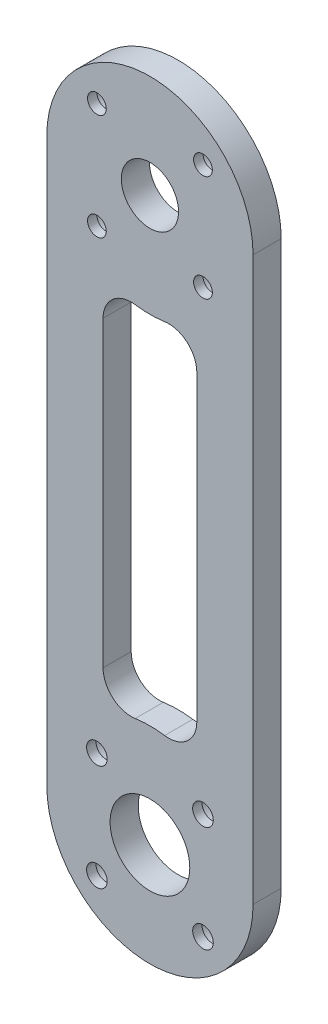
ISO-10303-21;
HEADER;
FILE_DESCRIPTION(('STEP AP214'),'2;1');
FILE_NAME('part.step','',(''),(''),'','','');
FILE_SCHEMA(('AUTOMOTIVE_DESIGN { 1 0 10303 214 1 1 1 1 }'));
ENDSEC;
DATA;
#1=APPLICATION_CONTEXT('core data for automotive mechanical design processes');
#2=APPLICATION_PROTOCOL_DEFINITION('international standard','automotive_design',2000,#1);
#3=PRODUCT_CONTEXT('',#1,'mechanical');
#4=PRODUCT('Part','Part','',(#3));
#5=PRODUCT_RELATED_PRODUCT_CATEGORY('part','',(#4));
#6=PRODUCT_DEFINITION_FORMATION('','',#4);
#7=PRODUCT_DEFINITION_CONTEXT('part definition',#1,'design');
#8=PRODUCT_DEFINITION('design','',#6,#7);
#9=PRODUCT_DEFINITION_SHAPE('','',#8);
#10=(LENGTH_UNIT() NAMED_UNIT(*) SI_UNIT(.MILLI.,.METRE.));
#11=(NAMED_UNIT(*) PLANE_ANGLE_UNIT() SI_UNIT($,.RADIAN.));
#12=(NAMED_UNIT(*) SI_UNIT($,.STERADIAN.) SOLID_ANGLE_UNIT());
#13=UNCERTAINTY_MEASURE_WITH_UNIT(LENGTH_MEASURE(1.E-05),#10,'distance_accuracy_value','');
#14=(GEOMETRIC_REPRESENTATION_CONTEXT(3) GLOBAL_UNCERTAINTY_ASSIGNED_CONTEXT((#13)) GLOBAL_UNIT_ASSIGNED_CONTEXT((#10,
#11,#12)) REPRESENTATION_CONTEXT('',''));
#15=CARTESIAN_POINT('',(0.,0.,0.));
#16=DIRECTION('',(0.,0.,1.));
#17=DIRECTION('',(1.,0.,0.));
#18=AXIS2_PLACEMENT_3D('',#15,#16,#17);
#19=CARTESIAN_POINT('',(5.65685424949247,24.3431457505077,8.62670273047588));
#20=DIRECTION('',(0.,0.,-1.));
#21=DIRECTION('',(1.,0.,0.));
#22=AXIS2_PLACEMENT_3D('',#19,#20,#21);
#23=CYLINDRICAL_SURFACE('',#22,1.);
#24=CARTESIAN_POINT('',(5.65685424949247,24.3431457505077,0.));
#25=DIRECTION('',(0.,0.,1.));
#26=DIRECTION('',(1.,0.,0.));
#27=AXIS2_PLACEMENT_3D('',#24,#25,#26);
#28=CIRCLE('',#27,1.);
#29=CARTESIAN_POINT('',(6.65685424949247,24.3431457505077,0.));
#30=VERTEX_POINT('',#29);
#31=EDGE_CURVE('E355',#30,#30,#28,.F.);
#32=ORIENTED_EDGE('',*,*,#31,.F.);
#33=EDGE_LOOP('',(#32));
#34=FACE_BOUND('',#33,.T.);
#35=CARTESIAN_POINT('',(5.65685424949247,24.3431457505077,-1.));
#36=DIRECTION('',(0.,0.,1.));
#37=DIRECTION('',(1.,0.,0.));
#38=AXIS2_PLACEMENT_3D('',#35,#36,#37);
#39=CIRCLE('',#38,1.);
#40=CARTESIAN_POINT('',(6.65685424949247,24.3431457505077,-1.));
#41=VERTEX_POINT('',#40);
#42=EDGE_CURVE('E450',#41,#41,#39,.F.);
#43=ORIENTED_EDGE('',*,*,#42,.T.);
#44=EDGE_LOOP('',(#43));
#45=FACE_BOUND('',#44,.T.);
#46=ADVANCED_FACE('F37',(#34,#45),#23,.F.);
#47=CARTESIAN_POINT('',(-5.65685424949235,24.3431457505076,8.62670273047588));
#48=DIRECTION('',(0.,0.,-1.));
#49=DIRECTION('',(1.,0.,0.));
#50=AXIS2_PLACEMENT_3D('',#47,#48,#49);
#51=CYLINDRICAL_SURFACE('',#50,1.);
#52=CARTESIAN_POINT('',(-5.65685424949235,24.3431457505076,0.));
#53=DIRECTION('',(0.,0.,1.));
#54=DIRECTION('',(1.,0.,0.));
#55=AXIS2_PLACEMENT_3D('',#52,#53,#54);
#56=CIRCLE('',#55,1.);
#57=CARTESIAN_POINT('',(-4.65685424949235,24.3431457505076,0.));
#58=VERTEX_POINT('',#57);
#59=EDGE_CURVE('E352',#58,#58,#56,.F.);
#60=ORIENTED_EDGE('',*,*,#59,.F.);
#61=EDGE_LOOP('',(#60));
#62=FACE_BOUND('',#61,.T.);
#63=CARTESIAN_POINT('',(-5.65685424949235,24.3431457505076,-1.));
#64=DIRECTION('',(0.,0.,1.));
#65=DIRECTION('',(1.,0.,0.));
#66=AXIS2_PLACEMENT_3D('',#63,#64,#65);
#67=CIRCLE('',#66,1.);
#68=CARTESIAN_POINT('',(-4.65685424949235,24.3431457505076,-1.));
#69=VERTEX_POINT('',#68);
#70=EDGE_CURVE('E448',#69,#69,#67,.F.);
#71=ORIENTED_EDGE('',*,*,#70,.T.);
#72=EDGE_LOOP('',(#71));
#73=FACE_BOUND('',#72,.T.);
#74=ADVANCED_FACE('F259',(#62,#73),#51,.F.);
#75=CARTESIAN_POINT('',(-5.65685424949243,35.6568542494923,8.62670273047588));
#76=DIRECTION('',(0.,0.,-1.));
#77=DIRECTION('',(1.,0.,0.));
#78=AXIS2_PLACEMENT_3D('',#75,#76,#77);
#79=CYLINDRICAL_SURFACE('',#78,1.);
#80=CARTESIAN_POINT('',(-5.65685424949243,35.6568542494923,0.));
#81=DIRECTION('',(0.,0.,1.));
#82=DIRECTION('',(1.,0.,0.));
#83=AXIS2_PLACEMENT_3D('',#80,#81,#82);
#84=CIRCLE('',#83,1.);
#85=CARTESIAN_POINT('',(-4.65685424949243,35.6568542494923,0.));
#86=VERTEX_POINT('',#85);
#87=EDGE_CURVE('E348',#86,#86,#84,.F.);
#88=ORIENTED_EDGE('',*,*,#87,.F.);
#89=EDGE_LOOP('',(#88));
#90=FACE_BOUND('',#89,.T.);
#91=CARTESIAN_POINT('',(-5.65685424949243,35.6568542494923,-1.));
#92=DIRECTION('',(0.,0.,1.));
#93=DIRECTION('',(1.,0.,0.));
#94=AXIS2_PLACEMENT_3D('',#91,#92,#93);
#95=CIRCLE('',#94,1.);
#96=CARTESIAN_POINT('',(-4.65685424949243,35.6568542494923,-1.));
#97=VERTEX_POINT('',#96);
#98=EDGE_CURVE('E458',#97,#97,#95,.F.);
#99=ORIENTED_EDGE('',*,*,#98,.T.);
#100=EDGE_LOOP('',(#99));
#101=FACE_BOUND('',#100,.T.);
#102=ADVANCED_FACE('F265',(#90,#101),#79,.F.);
#103=CARTESIAN_POINT('',(5.65685424949234,35.6568542494924,8.62670273047588));
#104=DIRECTION('',(0.,0.,-1.));
#105=DIRECTION('',(1.,0.,0.));
#106=AXIS2_PLACEMENT_3D('',#103,#104,#105);
#107=CYLINDRICAL_SURFACE('',#106,1.);
#108=CARTESIAN_POINT('',(5.65685424949234,35.6568542494924,0.));
#109=DIRECTION('',(0.,0.,1.));
#110=DIRECTION('',(1.,0.,0.));
#111=AXIS2_PLACEMENT_3D('',#108,#109,#110);
#112=CIRCLE('',#111,1.);
#113=CARTESIAN_POINT('',(6.65685424949234,35.6568542494924,0.));
#114=VERTEX_POINT('',#113);
#115=EDGE_CURVE('E359',#114,#114,#112,.F.);
#116=ORIENTED_EDGE('',*,*,#115,.F.);
#117=EDGE_LOOP('',(#116));
#118=FACE_BOUND('',#117,.T.);
#119=CARTESIAN_POINT('',(5.65685424949234,35.6568542494924,-1.));
#120=DIRECTION('',(0.,0.,1.));
#121=DIRECTION('',(1.,0.,0.));
#122=AXIS2_PLACEMENT_3D('',#119,#120,#121);
#123=CIRCLE('',#122,1.);
#124=CARTESIAN_POINT('',(6.65685424949234,35.6568542494924,-1.));
#125=VERTEX_POINT('',#124);
#126=EDGE_CURVE('E436',#125,#125,#123,.F.);
#127=ORIENTED_EDGE('',*,*,#126,.T.);
#128=EDGE_LOOP('',(#127));
#129=FACE_BOUND('',#128,.T.);
#130=ADVANCED_FACE('F283',(#118,#129),#107,.F.);
#131=CARTESIAN_POINT('',(-5.65685424949239,-35.6568542494924,12.0208152801713));
#132=DIRECTION('',(0.,0.,-1.));
#133=DIRECTION('',(1.,0.,0.));
#134=AXIS2_PLACEMENT_3D('',#131,#132,#133);
#135=CYLINDRICAL_SURFACE('',#134,1.1);
#136=CARTESIAN_POINT('',(-5.65685424949239,-35.6568542494924,0.));
#137=DIRECTION('',(0.,0.,1.));
#138=DIRECTION('',(1.,0.,0.));
#139=AXIS2_PLACEMENT_3D('',#136,#137,#138);
#140=CIRCLE('',#139,1.1);
#141=CARTESIAN_POINT('',(-4.55685424949239,-35.6568542494924,0.));
#142=VERTEX_POINT('',#141);
#143=EDGE_CURVE('E375',#142,#142,#140,.F.);
#144=ORIENTED_EDGE('',*,*,#143,.F.);
#145=EDGE_LOOP('',(#144));
#146=FACE_BOUND('',#145,.T.);
#147=CARTESIAN_POINT('',(-5.65685424949239,-35.6568542494924,-1.));
#148=DIRECTION('',(0.,0.,1.));
#149=DIRECTION('',(1.,0.,0.));
#150=AXIS2_PLACEMENT_3D('',#147,#148,#149);
#151=CIRCLE('',#150,1.1);
#152=CARTESIAN_POINT('',(-4.55685424949239,-35.6568542494924,-1.));
#153=VERTEX_POINT('',#152);
#154=EDGE_CURVE('E411',#153,#153,#151,.F.);
#155=ORIENTED_EDGE('',*,*,#154,.T.);
#156=EDGE_LOOP('',(#155));
#157=FACE_BOUND('',#156,.T.);
#158=ADVANCED_FACE('F286',(#146,#157),#135,.F.);
#159=CARTESIAN_POINT('',(5.65685424949235,-35.6568542494924,12.0208152801713));
#160=DIRECTION('',(0.,0.,-1.));
#161=DIRECTION('',(1.,0.,0.));
#162=AXIS2_PLACEMENT_3D('',#159,#160,#161);
#163=CYLINDRICAL_SURFACE('',#162,1.1);
#164=CARTESIAN_POINT('',(5.65685424949235,-35.6568542494924,0.));
#165=DIRECTION('',(0.,0.,1.));
#166=DIRECTION('',(1.,0.,0.));
#167=AXIS2_PLACEMENT_3D('',#164,#165,#166);
#168=CIRCLE('',#167,1.1);
#169=CARTESIAN_POINT('',(6.75685424949235,-35.6568542494924,0.));
#170=VERTEX_POINT('',#169);
#171=EDGE_CURVE('E371',#170,#170,#168,.F.);
#172=ORIENTED_EDGE('',*,*,#171,.F.);
#173=EDGE_LOOP('',(#172));
#174=FACE_BOUND('',#173,.T.);
#175=CARTESIAN_POINT('',(5.65685424949235,-35.6568542494924,-1.));
#176=DIRECTION('',(0.,0.,1.));
#177=DIRECTION('',(1.,0.,0.));
#178=AXIS2_PLACEMENT_3D('',#175,#176,#177);
#179=CIRCLE('',#178,1.1);
#180=CARTESIAN_POINT('',(6.75685424949235,-35.6568542494924,-1.));
#181=VERTEX_POINT('',#180);
#182=EDGE_CURVE('E398',#181,#181,#179,.F.);
#183=ORIENTED_EDGE('',*,*,#182,.T.);
#184=EDGE_LOOP('',(#183));
#185=FACE_BOUND('',#184,.T.);
#186=ADVANCED_FACE('F318',(#174,#185),#163,.F.);
#187=CARTESIAN_POINT('',(-5.65685424949231,-24.3431457505075,12.0208152801713));
#188=DIRECTION('',(0.,0.,-1.));
#189=DIRECTION('',(1.,0.,0.));
#190=AXIS2_PLACEMENT_3D('',#187,#188,#189);
#191=CYLINDRICAL_SURFACE('',#190,1.1);
#192=CARTESIAN_POINT('',(-5.65685424949231,-24.3431457505075,0.));
#193=DIRECTION('',(0.,0.,1.));
#194=DIRECTION('',(1.,0.,0.));
#195=AXIS2_PLACEMENT_3D('',#192,#193,#194);
#196=CIRCLE('',#195,1.1);
#197=CARTESIAN_POINT('',(-4.55685424949231,-24.3431457505075,0.));
#198=VERTEX_POINT('',#197);
#199=EDGE_CURVE('E367',#198,#198,#196,.F.);
#200=ORIENTED_EDGE('',*,*,#199,.F.);
#201=EDGE_LOOP('',(#200));
#202=FACE_BOUND('',#201,.T.);
#203=CARTESIAN_POINT('',(-5.65685424949231,-24.3431457505075,-1.));
#204=DIRECTION('',(0.,0.,1.));
#205=DIRECTION('',(1.,0.,0.));
#206=AXIS2_PLACEMENT_3D('',#203,#204,#205);
#207=CIRCLE('',#206,1.1);
#208=CARTESIAN_POINT('',(-4.55685424949231,-24.3431457505075,-1.));
#209=VERTEX_POINT('',#208);
#210=EDGE_CURVE('E401',#209,#209,#207,.F.);
#211=ORIENTED_EDGE('',*,*,#210,.T.);
#212=EDGE_LOOP('',(#211));
#213=FACE_BOUND('',#212,.T.);
#214=ADVANCED_FACE('F322',(#202,#213),#191,.F.);
#215=CARTESIAN_POINT('',(5.65685424949239,-24.3431457505076,12.0208152801713));
#216=DIRECTION('',(0.,0.,-1.));
#217=DIRECTION('',(1.,0.,0.));
#218=AXIS2_PLACEMENT_3D('',#215,#216,#217);
#219=CYLINDRICAL_SURFACE('',#218,1.1);
#220=CARTESIAN_POINT('',(5.65685424949239,-24.3431457505076,0.));
#221=DIRECTION('',(0.,0.,1.));
#222=DIRECTION('',(1.,0.,0.));
#223=AXIS2_PLACEMENT_3D('',#220,#221,#222);
#224=CIRCLE('',#223,1.1);
#225=CARTESIAN_POINT('',(6.75685424949239,-24.3431457505076,0.));
#226=VERTEX_POINT('',#225);
#227=EDGE_CURVE('E381',#226,#226,#224,.F.);
#228=ORIENTED_EDGE('',*,*,#227,.F.);
#229=EDGE_LOOP('',(#228));
#230=FACE_BOUND('',#229,.T.);
#231=CARTESIAN_POINT('',(5.65685424949239,-24.3431457505076,-1.));
#232=DIRECTION('',(0.,0.,1.));
#233=DIRECTION('',(1.,0.,0.));
#234=AXIS2_PLACEMENT_3D('',#231,#232,#233);
#235=CIRCLE('',#234,1.1);
#236=CARTESIAN_POINT('',(6.75685424949239,-24.3431457505076,-1.));
#237=VERTEX_POINT('',#236);
#238=EDGE_CURVE('E383',#237,#237,#235,.F.);
#239=ORIENTED_EDGE('',*,*,#238,.T.);
#240=EDGE_LOOP('',(#239));
#241=FACE_BOUND('',#240,.T.);
#242=ADVANCED_FACE('F326',(#230,#241),#219,.F.);
#243=CARTESIAN_POINT('',(0.,30.,-3.));
#244=DIRECTION('',(0.,0.,1.));
#245=DIRECTION('',(-1.,0.,0.));
#246=AXIS2_PLACEMENT_3D('',#243,#244,#245);
#247=CYLINDRICAL_SURFACE('',#246,11.);
#248=CARTESIAN_POINT('',(0.,30.,0.));
#249=DIRECTION('',(0.,0.,1.));
#250=DIRECTION('',(1.,0.,0.));
#251=AXIS2_PLACEMENT_3D('',#248,#249,#250);
#252=CIRCLE('',#251,11.);
#253=CARTESIAN_POINT('',(11.,30.,0.));
#254=VERTEX_POINT('',#253);
#255=CARTESIAN_POINT('',(-11.,30.,0.));
#256=VERTEX_POINT('',#255);
#257=EDGE_CURVE('E175',#254,#256,#252,.T.);
#258=ORIENTED_EDGE('',*,*,#257,.F.);
#259=DIRECTION('',(0.,0.,1.));
#260=VECTOR('',#259,1.);
#261=CARTESIAN_POINT('',(11.,30.,-3.));
#262=LINE('',#261,#260);
#263=CARTESIAN_POINT('',(11.,30.,-3.));
#264=VERTEX_POINT('',#263);
#265=EDGE_CURVE('E151',#264,#254,#262,.T.);
#266=ORIENTED_EDGE('',*,*,#265,.F.);
#267=CARTESIAN_POINT('',(0.,30.,-3.));
#268=DIRECTION('',(0.,0.,1.));
#269=DIRECTION('',(1.,0.,0.));
#270=AXIS2_PLACEMENT_3D('',#267,#268,#269);
#271=CIRCLE('',#270,11.);
#272=CARTESIAN_POINT('',(-11.,30.,-3.));
#273=VERTEX_POINT('',#272);
#274=EDGE_CURVE('E130',#264,#273,#271,.T.);
#275=ORIENTED_EDGE('',*,*,#274,.T.);
#276=DIRECTION('',(0.,0.,1.));
#277=VECTOR('',#276,1.);
#278=CARTESIAN_POINT('',(-11.,30.,-3.));
#279=LINE('',#278,#277);
#280=EDGE_CURVE('E139',#273,#256,#279,.T.);
#281=ORIENTED_EDGE('',*,*,#280,.T.);
#282=EDGE_LOOP('',(#258,#266,#275,#281));
#283=FACE_BOUND('',#282,.T.);
#284=ADVANCED_FACE('F149',(#283),#247,.T.);
#285=CARTESIAN_POINT('',(-11.,0.,-3.));
#286=DIRECTION('',(1.,0.,0.));
#287=DIRECTION('',(0.,1.,0.));
#288=AXIS2_PLACEMENT_3D('',#285,#286,#287);
#289=PLANE('',#288);
#290=DIRECTION('',(0.,-1.,0.));
#291=VECTOR('',#290,1.);
#292=CARTESIAN_POINT('',(-11.,0.,0.));
#293=LINE('',#292,#291);
#294=CARTESIAN_POINT('',(-11.,-30.,0.));
#295=VERTEX_POINT('',#294);
#296=EDGE_CURVE('E142',#256,#295,#293,.T.);
#297=ORIENTED_EDGE('',*,*,#296,.F.);
#298=ORIENTED_EDGE('',*,*,#280,.F.);
#299=DIRECTION('',(0.,-1.,0.));
#300=VECTOR('',#299,1.);
#301=CARTESIAN_POINT('',(-11.,0.,-3.));
#302=LINE('',#301,#300);
#303=CARTESIAN_POINT('',(-11.,-30.,-3.));
#304=VERTEX_POINT('',#303);
#305=EDGE_CURVE('E126',#273,#304,#302,.T.);
#306=ORIENTED_EDGE('',*,*,#305,.T.);
#307=DIRECTION('',(0.,0.,1.));
#308=VECTOR('',#307,1.);
#309=CARTESIAN_POINT('',(-11.,-30.,-3.));
#310=LINE('',#309,#308);
#311=EDGE_CURVE('E147',#304,#295,#310,.T.);
#312=ORIENTED_EDGE('',*,*,#311,.T.);
#313=EDGE_LOOP('',(#297,#298,#306,#312));
#314=FACE_BOUND('',#313,.T.);
#315=ADVANCED_FACE('F140',(#314),#289,.F.);
#316=CARTESIAN_POINT('',(0.,-30.,-3.));
#317=DIRECTION('',(0.,0.,1.));
#318=DIRECTION('',(-1.,0.,0.));
#319=AXIS2_PLACEMENT_3D('',#316,#317,#318);
#320=CYLINDRICAL_SURFACE('',#319,11.);
#321=CARTESIAN_POINT('',(0.,-30.,0.));
#322=DIRECTION('',(0.,0.,1.));
#323=DIRECTION('',(1.,0.,0.));
#324=AXIS2_PLACEMENT_3D('',#321,#322,#323);
#325=CIRCLE('',#324,11.);
#326=CARTESIAN_POINT('',(11.,-30.,0.));
#327=VERTEX_POINT('',#326);
#328=EDGE_CURVE('E169',#295,#327,#325,.T.);
#329=ORIENTED_EDGE('',*,*,#328,.F.);
#330=ORIENTED_EDGE('',*,*,#311,.F.);
#331=CARTESIAN_POINT('',(0.,-30.,-3.));
#332=DIRECTION('',(0.,0.,1.));
#333=DIRECTION('',(1.,0.,0.));
#334=AXIS2_PLACEMENT_3D('',#331,#332,#333);
#335=CIRCLE('',#334,11.);
#336=CARTESIAN_POINT('',(11.,-30.,-3.));
#337=VERTEX_POINT('',#336);
#338=EDGE_CURVE('E133',#304,#337,#335,.T.);
#339=ORIENTED_EDGE('',*,*,#338,.T.);
#340=DIRECTION('',(0.,0.,1.));
#341=VECTOR('',#340,1.);
#342=CARTESIAN_POINT('',(11.,-30.,-3.));
#343=LINE('',#342,#341);
#344=EDGE_CURVE('E181',#337,#327,#343,.T.);
#345=ORIENTED_EDGE('',*,*,#344,.T.);
#346=EDGE_LOOP('',(#329,#330,#339,#345));
#347=FACE_BOUND('',#346,.T.);
#348=ADVANCED_FACE('F242',(#347),#320,.T.);
#349=CARTESIAN_POINT('',(5.,0.,-3.));
#350=DIRECTION('',(1.,0.,0.));
#351=DIRECTION('',(0.,0.,1.));
#352=AXIS2_PLACEMENT_3D('',#349,#350,#351);
#353=PLANE('',#352);
#354=DIRECTION('',(0.,-1.,0.));
#355=VECTOR('',#354,1.);
#356=CARTESIAN_POINT('',(5.,0.,0.));
#357=LINE('',#356,#355);
#358=CARTESIAN_POINT('',(5.,16.143593539449,0.));
#359=VERTEX_POINT('',#358);
#360=CARTESIAN_POINT('',(5.,-16.143593539449,0.));
#361=VERTEX_POINT('',#360);
#362=EDGE_CURVE('E161',#359,#361,#357,.T.);
#363=ORIENTED_EDGE('',*,*,#362,.F.);
#364=DIRECTION('',(0.,0.,-1.));
#365=VECTOR('',#364,1.);
#366=CARTESIAN_POINT('',(5.,16.143593539449,0.));
#367=LINE('',#366,#365);
#368=CARTESIAN_POINT('',(5.,16.143593539449,-3.));
#369=VERTEX_POINT('',#368);
#370=EDGE_CURVE('E195',#369,#359,#367,.F.);
#371=ORIENTED_EDGE('',*,*,#370,.F.);
#372=DIRECTION('',(0.,-1.,0.));
#373=VECTOR('',#372,1.);
#374=CARTESIAN_POINT('',(5.,0.,-3.));
#375=LINE('',#374,#373);
#376=CARTESIAN_POINT('',(5.,-16.143593539449,-3.));
#377=VERTEX_POINT('',#376);
#378=EDGE_CURVE('E179',#369,#377,#375,.T.);
#379=ORIENTED_EDGE('',*,*,#378,.T.);
#380=DIRECTION('',(0.,0.,-1.));
#381=VECTOR('',#380,1.);
#382=CARTESIAN_POINT('',(5.,-16.143593539449,-3.));
#383=LINE('',#382,#381);
#384=EDGE_CURVE('E198',#361,#377,#383,.T.);
#385=ORIENTED_EDGE('',*,*,#384,.F.);
#386=EDGE_LOOP('',(#363,#371,#379,#385));
#387=FACE_BOUND('',#386,.T.);
#388=ADVANCED_FACE('F538',(#387),#353,.F.);
#389=CARTESIAN_POINT('',(1.57142857142857,-19.1128234952813,0.));
#390=VERTEX_POINT('',#389);
#391=CARTESIAN_POINT('',(-1.57142857142857,-19.1128234952813,0.));
#392=VERTEX_POINT('',#391);
#393=EDGE_CURVE('E164',#390,#392,#325,.T.);
#394=ORIENTED_EDGE('',*,*,#393,.F.);
#395=DIRECTION('',(0.,0.,1.));
#396=VECTOR('',#395,1.);
#397=CARTESIAN_POINT('',(1.57142857142857,-19.1128234952813,-3.));
#398=LINE('',#397,#396);
#399=CARTESIAN_POINT('',(1.57142857142857,-19.1128234952813,-3.));
#400=VERTEX_POINT('',#399);
#401=EDGE_CURVE('E189',#400,#390,#398,.T.);
#402=ORIENTED_EDGE('',*,*,#401,.F.);
#403=CARTESIAN_POINT('',(-1.57142857142857,-19.1128234952813,-3.));
#404=VERTEX_POINT('',#403);
#405=EDGE_CURVE('E233',#400,#404,#335,.T.);
#406=ORIENTED_EDGE('',*,*,#405,.T.);
#407=DIRECTION('',(0.,0.,1.));
#408=VECTOR('',#407,1.);
#409=CARTESIAN_POINT('',(-1.57142857142857,-19.1128234952813,-3.));
#410=LINE('',#409,#408);
#411=EDGE_CURVE('E192',#392,#404,#410,.F.);
#412=ORIENTED_EDGE('',*,*,#411,.F.);
#413=EDGE_LOOP('',(#394,#402,#406,#412));
#414=FACE_BOUND('',#413,.T.);
#415=ADVANCED_FACE('F707',(#414),#320,.T.);
#416=CARTESIAN_POINT('',(-5.,0.,-3.));
#417=DIRECTION('',(1.,0.,0.));
#418=DIRECTION('',(0.,0.,1.));
#419=AXIS2_PLACEMENT_3D('',#416,#417,#418);
#420=PLANE('',#419);
#421=DIRECTION('',(0.,-1.,0.));
#422=VECTOR('',#421,1.);
#423=CARTESIAN_POINT('',(-5.,0.,-3.));
#424=LINE('',#423,#422);
#425=CARTESIAN_POINT('',(-5.,16.143593539449,-3.));
#426=VERTEX_POINT('',#425);
#427=CARTESIAN_POINT('',(-5.,-16.143593539449,-3.));
#428=VERTEX_POINT('',#427);
#429=EDGE_CURVE('E155',#426,#428,#424,.T.);
#430=ORIENTED_EDGE('',*,*,#429,.F.);
#431=DIRECTION('',(0.,0.,1.));
#432=VECTOR('',#431,1.);
#433=CARTESIAN_POINT('',(-5.,16.143593539449,-3.));
#434=LINE('',#433,#432);
#435=CARTESIAN_POINT('',(-5.,16.143593539449,0.));
#436=VERTEX_POINT('',#435);
#437=EDGE_CURVE('E146',#436,#426,#434,.F.);
#438=ORIENTED_EDGE('',*,*,#437,.F.);
#439=DIRECTION('',(0.,-1.,0.));
#440=VECTOR('',#439,1.);
#441=CARTESIAN_POINT('',(-5.,0.,0.));
#442=LINE('',#441,#440);
#443=CARTESIAN_POINT('',(-5.,-16.143593539449,0.));
#444=VERTEX_POINT('',#443);
#445=EDGE_CURVE('E168',#436,#444,#442,.T.);
#446=ORIENTED_EDGE('',*,*,#445,.T.);
#447=DIRECTION('',(0.,0.,1.));
#448=VECTOR('',#447,1.);
#449=CARTESIAN_POINT('',(-5.,-16.143593539449,-3.));
#450=LINE('',#449,#448);
#451=EDGE_CURVE('E186',#428,#444,#450,.T.);
#452=ORIENTED_EDGE('',*,*,#451,.F.);
#453=EDGE_LOOP('',(#430,#438,#446,#452));
#454=FACE_BOUND('',#453,.T.);
#455=ADVANCED_FACE('F232',(#454),#420,.T.);
#456=CARTESIAN_POINT('',(-1.57142857142858,19.1128234952813,-3.));
#457=VERTEX_POINT('',#456);
#458=CARTESIAN_POINT('',(1.57142857142857,19.1128234952813,-3.));
#459=VERTEX_POINT('',#458);
#460=EDGE_CURVE('E152',#457,#459,#271,.T.);
#461=ORIENTED_EDGE('',*,*,#460,.T.);
#462=DIRECTION('',(0.,0.,1.));
#463=VECTOR('',#462,1.);
#464=CARTESIAN_POINT('',(1.57142857142857,19.1128234952813,-3.));
#465=LINE('',#464,#463);
#466=CARTESIAN_POINT('',(1.57142857142857,19.1128234952813,0.));
#467=VERTEX_POINT('',#466);
#468=EDGE_CURVE('E201',#467,#459,#465,.F.);
#469=ORIENTED_EDGE('',*,*,#468,.F.);
#470=CARTESIAN_POINT('',(-1.57142857142858,19.1128234952813,0.));
#471=VERTEX_POINT('',#470);
#472=EDGE_CURVE('E172',#471,#467,#252,.T.);
#473=ORIENTED_EDGE('',*,*,#472,.F.);
#474=DIRECTION('',(0.,0.,1.));
#475=VECTOR('',#474,1.);
#476=CARTESIAN_POINT('',(-1.57142857142858,19.1128234952813,-3.));
#477=LINE('',#476,#475);
#478=EDGE_CURVE('E203',#457,#471,#477,.T.);
#479=ORIENTED_EDGE('',*,*,#478,.F.);
#480=EDGE_LOOP('',(#461,#469,#473,#479));
#481=FACE_BOUND('',#480,.T.);
#482=ADVANCED_FACE('F225',(#481),#247,.T.);
#483=CARTESIAN_POINT('',(11.,0.,-3.));
#484=DIRECTION('',(1.,0.,0.));
#485=DIRECTION('',(0.,1.,0.));
#486=AXIS2_PLACEMENT_3D('',#483,#484,#485);
#487=PLANE('',#486);
#488=DIRECTION('',(0.,-1.,0.));
#489=VECTOR('',#488,1.);
#490=CARTESIAN_POINT('',(11.,0.,0.));
#491=LINE('',#490,#489);
#492=EDGE_CURVE('E177',#254,#327,#491,.T.);
#493=ORIENTED_EDGE('',*,*,#492,.T.);
#494=ORIENTED_EDGE('',*,*,#344,.F.);
#495=DIRECTION('',(0.,-1.,0.));
#496=VECTOR('',#495,1.);
#497=CARTESIAN_POINT('',(11.,0.,-3.));
#498=LINE('',#497,#496);
#499=EDGE_CURVE('E159',#264,#337,#498,.T.);
#500=ORIENTED_EDGE('',*,*,#499,.F.);
#501=ORIENTED_EDGE('',*,*,#265,.T.);
#502=EDGE_LOOP('',(#493,#494,#500,#501));
#503=FACE_BOUND('',#502,.T.);
#504=ADVANCED_FACE('F246',(#503),#487,.T.);
#505=CARTESIAN_POINT('',(0.,0.,-3.));
#506=DIRECTION('',(0.,0.,-1.));
#507=DIRECTION('',(1.,0.,0.));
#508=AXIS2_PLACEMENT_3D('',#505,#506,#507);
#509=PLANE('',#508);
#510=CARTESIAN_POINT('',(-5.65685424949243,35.6568542494923,-3.));
#511=DIRECTION('',(0.,0.,1.));
#512=DIRECTION('',(0.,1.,0.));
#513=AXIS2_PLACEMENT_3D('',#510,#511,#512);
#514=CIRCLE('',#513,2.00000000000001);
#515=CARTESIAN_POINT('',(-5.65685424949244,37.6568542494923,-3.));
#516=VERTEX_POINT('',#515);
#517=EDGE_CURVE('E466',#516,#516,#514,.T.);
#518=ORIENTED_EDGE('',*,*,#517,.T.);
#519=EDGE_LOOP('',(#518));
#520=FACE_BOUND('',#519,.T.);
#521=CARTESIAN_POINT('',(-5.65685424949235,24.3431457505076,-3.));
#522=DIRECTION('',(0.,0.,1.));
#523=DIRECTION('',(-1.,0.,0.));
#524=AXIS2_PLACEMENT_3D('',#521,#522,#523);
#525=CIRCLE('',#524,2.00000000000001);
#526=CARTESIAN_POINT('',(-7.65685424949236,24.3431457505076,-3.));
#527=VERTEX_POINT('',#526);
#528=EDGE_CURVE('E459',#527,#527,#525,.T.);
#529=ORIENTED_EDGE('',*,*,#528,.T.);
#530=EDGE_LOOP('',(#529));
#531=FACE_BOUND('',#530,.T.);
#532=CARTESIAN_POINT('',(5.65685424949247,24.3431457505077,-3.));
#533=DIRECTION('',(0.,0.,1.));
#534=DIRECTION('',(0.,-1.,0.));
#535=AXIS2_PLACEMENT_3D('',#532,#533,#534);
#536=CIRCLE('',#535,2.00000000000001);
#537=CARTESIAN_POINT('',(5.65685424949249,22.3431457505077,-3.));
#538=VERTEX_POINT('',#537);
#539=EDGE_CURVE('E449',#538,#538,#536,.T.);
#540=ORIENTED_EDGE('',*,*,#539,.T.);
#541=EDGE_LOOP('',(#540));
#542=FACE_BOUND('',#541,.T.);
#543=CARTESIAN_POINT('',(5.65685424949234,35.6568542494924,-3.));
#544=DIRECTION('',(0.,0.,1.));
#545=DIRECTION('',(1.,0.,0.));
#546=AXIS2_PLACEMENT_3D('',#543,#544,#545);
#547=CIRCLE('',#546,2.00000000000001);
#548=CARTESIAN_POINT('',(7.65685424949235,35.6568542494924,-3.));
#549=VERTEX_POINT('',#548);
#550=EDGE_CURVE('E435',#549,#549,#547,.T.);
#551=ORIENTED_EDGE('',*,*,#550,.T.);
#552=EDGE_LOOP('',(#551));
#553=FACE_BOUND('',#552,.T.);
#554=CARTESIAN_POINT('',(0.,30.,-3.));
#555=DIRECTION('',(0.,0.,1.));
#556=DIRECTION('',(1.,0.,0.));
#557=AXIS2_PLACEMENT_3D('',#554,#555,#556);
#558=CIRCLE('',#557,3.05);
#559=CARTESIAN_POINT('',(3.05,30.,-3.));
#560=VERTEX_POINT('',#559);
#561=EDGE_CURVE('E428',#560,#560,#558,.T.);
#562=ORIENTED_EDGE('',*,*,#561,.T.);
#563=EDGE_LOOP('',(#562));
#564=FACE_BOUND('',#563,.T.);
#565=CARTESIAN_POINT('',(5.65685424949235,-35.6568542494924,-3.));
#566=DIRECTION('',(0.,0.,1.));
#567=DIRECTION('',(0.,-1.,0.));
#568=AXIS2_PLACEMENT_3D('',#565,#566,#567);
#569=CIRCLE('',#568,2.);
#570=CARTESIAN_POINT('',(5.65685424949234,-37.6568542494924,-3.));
#571=VERTEX_POINT('',#570);
#572=EDGE_CURVE('E414',#571,#571,#569,.T.);
#573=ORIENTED_EDGE('',*,*,#572,.T.);
#574=EDGE_LOOP('',(#573));
#575=FACE_BOUND('',#574,.T.);
#576=CARTESIAN_POINT('',(-5.65685424949239,-35.6568542494924,-3.));
#577=DIRECTION('',(0.,0.,1.));
#578=DIRECTION('',(-1.,0.,0.));
#579=AXIS2_PLACEMENT_3D('',#576,#577,#578);
#580=CIRCLE('',#579,2.);
#581=CARTESIAN_POINT('',(-7.65685424949239,-35.6568542494924,-3.));
#582=VERTEX_POINT('',#581);
#583=EDGE_CURVE('E404',#582,#582,#580,.T.);
#584=ORIENTED_EDGE('',*,*,#583,.T.);
#585=EDGE_LOOP('',(#584));
#586=FACE_BOUND('',#585,.T.);
#587=CARTESIAN_POINT('',(-5.65685424949231,-24.3431457505075,-3.));
#588=DIRECTION('',(0.,0.,1.));
#589=DIRECTION('',(0.,1.,0.));
#590=AXIS2_PLACEMENT_3D('',#587,#588,#589);
#591=CIRCLE('',#590,2.);
#592=CARTESIAN_POINT('',(-5.65685424949229,-22.3431457505075,-3.));
#593=VERTEX_POINT('',#592);
#594=EDGE_CURVE('E406',#593,#593,#591,.T.);
#595=ORIENTED_EDGE('',*,*,#594,.T.);
#596=EDGE_LOOP('',(#595));
#597=FACE_BOUND('',#596,.T.);
#598=CARTESIAN_POINT('',(5.65685424949239,-24.3431457505076,-3.));
#599=DIRECTION('',(0.,0.,1.));
#600=DIRECTION('',(1.,0.,0.));
#601=AXIS2_PLACEMENT_3D('',#598,#599,#600);
#602=CIRCLE('',#601,2.);
#603=CARTESIAN_POINT('',(7.65685424949239,-24.3431457505076,-3.));
#604=VERTEX_POINT('',#603);
#605=EDGE_CURVE('E392',#604,#604,#602,.T.);
#606=ORIENTED_EDGE('',*,*,#605,.T.);
#607=EDGE_LOOP('',(#606));
#608=FACE_BOUND('',#607,.T.);
#609=CARTESIAN_POINT('',(0.,-30.,-3.));
#610=DIRECTION('',(0.,0.,1.));
#611=DIRECTION('',(1.,0.,0.));
#612=AXIS2_PLACEMENT_3D('',#609,#610,#611);
#613=CIRCLE('',#612,4.25);
#614=CARTESIAN_POINT('',(4.25,-30.,-3.));
#615=VERTEX_POINT('',#614);
#616=EDGE_CURVE('E382',#615,#615,#613,.T.);
#617=ORIENTED_EDGE('',*,*,#616,.T.);
#618=EDGE_LOOP('',(#617));
#619=FACE_BOUND('',#618,.T.);
#620=ORIENTED_EDGE('',*,*,#460,.F.);
#621=CARTESIAN_POINT('',(-2.,16.143593539449,-3.));
#622=DIRECTION('',(0.,0.,1.));
#623=DIRECTION('',(1.,0.,0.));
#624=AXIS2_PLACEMENT_3D('',#621,#622,#623);
#625=CIRCLE('',#624,3.);
#626=EDGE_CURVE('E58',#426,#457,#625,.F.);
#627=ORIENTED_EDGE('',*,*,#626,.F.);
#628=ORIENTED_EDGE('',*,*,#429,.T.);
#629=CARTESIAN_POINT('',(-2.,-16.143593539449,-3.));
#630=DIRECTION('',(0.,0.,1.));
#631=DIRECTION('',(1.,0.,0.));
#632=AXIS2_PLACEMENT_3D('',#629,#630,#631);
#633=CIRCLE('',#632,3.);
#634=EDGE_CURVE('E207',#404,#428,#633,.F.);
#635=ORIENTED_EDGE('',*,*,#634,.F.);
#636=ORIENTED_EDGE('',*,*,#405,.F.);
#637=CARTESIAN_POINT('',(2.,-16.143593539449,-3.));
#638=DIRECTION('',(0.,0.,1.));
#639=DIRECTION('',(1.,0.,0.));
#640=AXIS2_PLACEMENT_3D('',#637,#638,#639);
#641=CIRCLE('',#640,3.);
#642=EDGE_CURVE('E211',#377,#400,#641,.F.);
#643=ORIENTED_EDGE('',*,*,#642,.F.);
#644=ORIENTED_EDGE('',*,*,#378,.F.);
#645=CARTESIAN_POINT('',(2.,16.143593539449,-3.));
#646=DIRECTION('',(0.,0.,1.));
#647=DIRECTION('',(1.,0.,0.));
#648=AXIS2_PLACEMENT_3D('',#645,#646,#647);
#649=CIRCLE('',#648,3.);
#650=EDGE_CURVE('E12',#459,#369,#649,.F.);
#651=ORIENTED_EDGE('',*,*,#650,.F.);
#652=EDGE_LOOP('',(#620,#627,#628,#635,#636,#643,#644,#651));
#653=FACE_BOUND('',#652,.T.);
#654=ORIENTED_EDGE('',*,*,#274,.F.);
#655=ORIENTED_EDGE('',*,*,#499,.T.);
#656=ORIENTED_EDGE('',*,*,#338,.F.);
#657=ORIENTED_EDGE('',*,*,#305,.F.);
#658=EDGE_LOOP('',(#654,#655,#656,#657));
#659=FACE_BOUND('',#658,.T.);
#660=ADVANCED_FACE('F128',(#520,#531,#542,#553,#564,#575,#586,#597,#608,#619,#653,#659),#509,.T.);
#661=CARTESIAN_POINT('',(0.,0.,0.));
#662=DIRECTION('',(0.,0.,-1.));
#663=DIRECTION('',(1.,0.,0.));
#664=AXIS2_PLACEMENT_3D('',#661,#662,#663);
#665=PLANE('',#664);
#666=ORIENTED_EDGE('',*,*,#87,.T.);
#667=EDGE_LOOP('',(#666));
#668=FACE_BOUND('',#667,.T.);
#669=ORIENTED_EDGE('',*,*,#59,.T.);
#670=EDGE_LOOP('',(#669));
#671=FACE_BOUND('',#670,.T.);
#672=ORIENTED_EDGE('',*,*,#31,.T.);
#673=EDGE_LOOP('',(#672));
#674=FACE_BOUND('',#673,.T.);
#675=ORIENTED_EDGE('',*,*,#115,.T.);
#676=EDGE_LOOP('',(#675));
#677=FACE_BOUND('',#676,.T.);
#678=CARTESIAN_POINT('',(0.,30.,0.));
#679=DIRECTION('',(0.,0.,1.));
#680=DIRECTION('',(1.,0.,0.));
#681=AXIS2_PLACEMENT_3D('',#678,#679,#680);
#682=CIRCLE('',#681,3.05);
#683=CARTESIAN_POINT('',(3.05,30.,0.));
#684=VERTEX_POINT('',#683);
#685=EDGE_CURVE('E363',#684,#684,#682,.F.);
#686=ORIENTED_EDGE('',*,*,#685,.T.);
#687=EDGE_LOOP('',(#686));
#688=FACE_BOUND('',#687,.T.);
#689=ORIENTED_EDGE('',*,*,#199,.T.);
#690=EDGE_LOOP('',(#689));
#691=FACE_BOUND('',#690,.T.);
#692=ORIENTED_EDGE('',*,*,#171,.T.);
#693=EDGE_LOOP('',(#692));
#694=FACE_BOUND('',#693,.T.);
#695=ORIENTED_EDGE('',*,*,#143,.T.);
#696=EDGE_LOOP('',(#695));
#697=FACE_BOUND('',#696,.T.);
#698=CARTESIAN_POINT('',(0.,-30.,0.));
#699=DIRECTION('',(0.,0.,1.));
#700=DIRECTION('',(1.,0.,0.));
#701=AXIS2_PLACEMENT_3D('',#698,#699,#700);
#702=CIRCLE('',#701,4.25);
#703=CARTESIAN_POINT('',(4.25,-30.,0.));
#704=VERTEX_POINT('',#703);
#705=EDGE_CURVE('E165',#704,#704,#702,.F.);
#706=ORIENTED_EDGE('',*,*,#705,.T.);
#707=EDGE_LOOP('',(#706));
#708=FACE_BOUND('',#707,.T.);
#709=ORIENTED_EDGE('',*,*,#227,.T.);
#710=EDGE_LOOP('',(#709));
#711=FACE_BOUND('',#710,.T.);
#712=ORIENTED_EDGE('',*,*,#362,.T.);
#713=CARTESIAN_POINT('',(2.,-16.143593539449,0.));
#714=DIRECTION('',(0.,0.,1.));
#715=DIRECTION('',(1.,0.,0.));
#716=AXIS2_PLACEMENT_3D('',#713,#714,#715);
#717=CIRCLE('',#716,3.);
#718=EDGE_CURVE('E209',#390,#361,#717,.T.);
#719=ORIENTED_EDGE('',*,*,#718,.F.);
#720=ORIENTED_EDGE('',*,*,#393,.T.);
#721=CARTESIAN_POINT('',(-2.,-16.143593539449,0.));
#722=DIRECTION('',(0.,0.,1.));
#723=DIRECTION('',(1.,0.,0.));
#724=AXIS2_PLACEMENT_3D('',#721,#722,#723);
#725=CIRCLE('',#724,3.);
#726=EDGE_CURVE('E205',#444,#392,#725,.T.);
#727=ORIENTED_EDGE('',*,*,#726,.F.);
#728=ORIENTED_EDGE('',*,*,#445,.F.);
#729=CARTESIAN_POINT('',(-2.,16.143593539449,0.));
#730=DIRECTION('',(0.,0.,1.));
#731=DIRECTION('',(1.,0.,0.));
#732=AXIS2_PLACEMENT_3D('',#729,#730,#731);
#733=CIRCLE('',#732,3.);
#734=EDGE_CURVE('E213',#471,#436,#733,.T.);
#735=ORIENTED_EDGE('',*,*,#734,.F.);
#736=ORIENTED_EDGE('',*,*,#472,.T.);
#737=CARTESIAN_POINT('',(2.,16.143593539449,0.));
#738=DIRECTION('',(0.,0.,1.));
#739=DIRECTION('',(1.,0.,0.));
#740=AXIS2_PLACEMENT_3D('',#737,#738,#739);
#741=CIRCLE('',#740,3.);
#742=EDGE_CURVE('E45',#359,#467,#741,.T.);
#743=ORIENTED_EDGE('',*,*,#742,.F.);
#744=EDGE_LOOP('',(#712,#719,#720,#727,#728,#735,#736,#743));
#745=FACE_BOUND('',#744,.T.);
#746=ORIENTED_EDGE('',*,*,#257,.T.);
#747=ORIENTED_EDGE('',*,*,#296,.T.);
#748=ORIENTED_EDGE('',*,*,#328,.T.);
#749=ORIENTED_EDGE('',*,*,#492,.F.);
#750=EDGE_LOOP('',(#746,#747,#748,#749));
#751=FACE_BOUND('',#750,.T.);
#752=ADVANCED_FACE('F221',(#668,#671,#674,#677,#688,#691,#694,#697,#708,#711,#745,#751),#665,.F.);
#753=CARTESIAN_POINT('',(0.,-30.,12.0208152801713));
#754=DIRECTION('',(0.,0.,-1.));
#755=DIRECTION('',(1.,0.,0.));
#756=AXIS2_PLACEMENT_3D('',#753,#754,#755);
#757=CYLINDRICAL_SURFACE('',#756,4.25);
#758=ORIENTED_EDGE('',*,*,#705,.F.);
#759=EDGE_LOOP('',(#758));
#760=FACE_BOUND('',#759,.T.);
#761=ORIENTED_EDGE('',*,*,#616,.F.);
#762=EDGE_LOOP('',(#761));
#763=FACE_BOUND('',#762,.T.);
#764=ADVANCED_FACE('F334',(#760,#763),#757,.F.);
#765=CARTESIAN_POINT('',(5.65685424949239,-24.3431457505076,5.65685424949239));
#766=DIRECTION('',(0.,0.,-1.));
#767=DIRECTION('',(1.,0.,0.));
#768=AXIS2_PLACEMENT_3D('',#765,#766,#767);
#769=CYLINDRICAL_SURFACE('',#768,2.);
#770=CARTESIAN_POINT('',(5.65685424949239,-24.3431457505076,-1.));
#771=DIRECTION('',(0.,0.,1.));
#772=DIRECTION('',(1.,0.,0.));
#773=AXIS2_PLACEMENT_3D('',#770,#771,#772);
#774=CIRCLE('',#773,2.);
#775=CARTESIAN_POINT('',(7.65685424949239,-24.3431457505076,-1.));
#776=VERTEX_POINT('',#775);
#777=EDGE_CURVE('E388',#776,#776,#774,.F.);
#778=ORIENTED_EDGE('',*,*,#777,.F.);
#779=EDGE_LOOP('',(#778));
#780=FACE_BOUND('',#779,.T.);
#781=ORIENTED_EDGE('',*,*,#605,.F.);
#782=EDGE_LOOP('',(#781));
#783=FACE_BOUND('',#782,.T.);
#784=ADVANCED_FACE('F330',(#780,#783),#769,.F.);
#785=CARTESIAN_POINT('',(0.,0.,-1.));
#786=DIRECTION('',(0.,0.,-1.));
#787=DIRECTION('',(1.,0.,0.));
#788=AXIS2_PLACEMENT_3D('',#785,#786,#787);
#789=PLANE('',#788);
#790=ORIENTED_EDGE('',*,*,#777,.T.);
#791=EDGE_LOOP('',(#790));
#792=FACE_BOUND('',#791,.T.);
#793=ORIENTED_EDGE('',*,*,#238,.F.);
#794=EDGE_LOOP('',(#793));
#795=FACE_BOUND('',#794,.T.);
#796=ADVANCED_FACE('F314',(#792,#795),#789,.T.);
#797=CARTESIAN_POINT('',(-5.65685424949231,-24.3431457505075,5.65685424949239));
#798=DIRECTION('',(0.,0.,-1.));
#799=DIRECTION('',(1.,0.,0.));
#800=AXIS2_PLACEMENT_3D('',#797,#798,#799);
#801=CYLINDRICAL_SURFACE('',#800,2.);
#802=CARTESIAN_POINT('',(-5.65685424949231,-24.3431457505075,-1.));
#803=DIRECTION('',(0.,0.,1.));
#804=DIRECTION('',(1.,0.,0.));
#805=AXIS2_PLACEMENT_3D('',#802,#803,#804);
#806=CIRCLE('',#805,2.);
#807=CARTESIAN_POINT('',(-3.65685424949231,-24.3431457505075,-1.));
#808=VERTEX_POINT('',#807);
#809=EDGE_CURVE('E405',#808,#808,#806,.F.);
#810=ORIENTED_EDGE('',*,*,#809,.F.);
#811=EDGE_LOOP('',(#810));
#812=FACE_BOUND('',#811,.T.);
#813=ORIENTED_EDGE('',*,*,#594,.F.);
#814=EDGE_LOOP('',(#813));
#815=FACE_BOUND('',#814,.T.);
#816=ADVANCED_FACE('F310',(#812,#815),#801,.F.);
#817=CARTESIAN_POINT('',(0.,0.,-1.));
#818=DIRECTION('',(0.,0.,-1.));
#819=DIRECTION('',(1.,0.,0.));
#820=AXIS2_PLACEMENT_3D('',#817,#818,#819);
#821=PLANE('',#820);
#822=ORIENTED_EDGE('',*,*,#809,.T.);
#823=EDGE_LOOP('',(#822));
#824=FACE_BOUND('',#823,.T.);
#825=ORIENTED_EDGE('',*,*,#210,.F.);
#826=EDGE_LOOP('',(#825));
#827=FACE_BOUND('',#826,.T.);
#828=ADVANCED_FACE('F300',(#824,#827),#821,.T.);
#829=CARTESIAN_POINT('',(5.65685424949235,-35.6568542494924,5.65685424949239));
#830=DIRECTION('',(0.,0.,-1.));
#831=DIRECTION('',(1.,0.,0.));
#832=AXIS2_PLACEMENT_3D('',#829,#830,#831);
#833=CYLINDRICAL_SURFACE('',#832,2.);
#834=CARTESIAN_POINT('',(5.65685424949235,-35.6568542494924,-1.));
#835=DIRECTION('',(0.,0.,1.));
#836=DIRECTION('',(1.,0.,0.));
#837=AXIS2_PLACEMENT_3D('',#834,#835,#836);
#838=CIRCLE('',#837,2.);
#839=CARTESIAN_POINT('',(7.65685424949235,-35.6568542494924,-1.));
#840=VERTEX_POINT('',#839);
#841=EDGE_CURVE('E422',#840,#840,#838,.F.);
#842=ORIENTED_EDGE('',*,*,#841,.F.);
#843=EDGE_LOOP('',(#842));
#844=FACE_BOUND('',#843,.T.);
#845=ORIENTED_EDGE('',*,*,#572,.F.);
#846=EDGE_LOOP('',(#845));
#847=FACE_BOUND('',#846,.T.);
#848=ADVANCED_FACE('F296',(#844,#847),#833,.F.);
#849=CARTESIAN_POINT('',(0.,0.,-1.));
#850=DIRECTION('',(0.,0.,-1.));
#851=DIRECTION('',(1.,0.,0.));
#852=AXIS2_PLACEMENT_3D('',#849,#850,#851);
#853=PLANE('',#852);
#854=ORIENTED_EDGE('',*,*,#841,.T.);
#855=EDGE_LOOP('',(#854));
#856=FACE_BOUND('',#855,.T.);
#857=ORIENTED_EDGE('',*,*,#182,.F.);
#858=EDGE_LOOP('',(#857));
#859=FACE_BOUND('',#858,.T.);
#860=ADVANCED_FACE('F292',(#856,#859),#853,.T.);
#861=CARTESIAN_POINT('',(-5.65685424949239,-35.6568542494924,5.65685424949239));
#862=DIRECTION('',(0.,0.,-1.));
#863=DIRECTION('',(1.,0.,0.));
#864=AXIS2_PLACEMENT_3D('',#861,#862,#863);
#865=CYLINDRICAL_SURFACE('',#864,2.);
#866=CARTESIAN_POINT('',(-5.65685424949239,-35.6568542494924,-1.));
#867=DIRECTION('',(0.,0.,1.));
#868=DIRECTION('',(1.,0.,0.));
#869=AXIS2_PLACEMENT_3D('',#866,#867,#868);
#870=CIRCLE('',#869,2.);
#871=CARTESIAN_POINT('',(-3.65685424949239,-35.6568542494924,-1.));
#872=VERTEX_POINT('',#871);
#873=EDGE_CURVE('E415',#872,#872,#870,.F.);
#874=ORIENTED_EDGE('',*,*,#873,.F.);
#875=EDGE_LOOP('',(#874));
#876=FACE_BOUND('',#875,.T.);
#877=ORIENTED_EDGE('',*,*,#583,.F.);
#878=EDGE_LOOP('',(#877));
#879=FACE_BOUND('',#878,.T.);
#880=ADVANCED_FACE('F295',(#876,#879),#865,.F.);
#881=CARTESIAN_POINT('',(0.,0.,-1.));
#882=DIRECTION('',(0.,0.,-1.));
#883=DIRECTION('',(1.,0.,0.));
#884=AXIS2_PLACEMENT_3D('',#881,#882,#883);
#885=PLANE('',#884);
#886=ORIENTED_EDGE('',*,*,#873,.T.);
#887=EDGE_LOOP('',(#886));
#888=FACE_BOUND('',#887,.T.);
#889=ORIENTED_EDGE('',*,*,#154,.F.);
#890=EDGE_LOOP('',(#889));
#891=FACE_BOUND('',#890,.T.);
#892=ADVANCED_FACE('F290',(#888,#891),#885,.T.);
#893=CARTESIAN_POINT('',(0.,30.,8.62670273047588));
#894=DIRECTION('',(0.,0.,-1.));
#895=DIRECTION('',(1.,0.,0.));
#896=AXIS2_PLACEMENT_3D('',#893,#894,#895);
#897=CYLINDRICAL_SURFACE('',#896,3.05);
#898=ORIENTED_EDGE('',*,*,#685,.F.);
#899=EDGE_LOOP('',(#898));
#900=FACE_BOUND('',#899,.T.);
#901=ORIENTED_EDGE('',*,*,#561,.F.);
#902=EDGE_LOOP('',(#901));
#903=FACE_BOUND('',#902,.T.);
#904=ADVANCED_FACE('F277',(#900,#903),#897,.F.);
#905=CARTESIAN_POINT('',(5.65685424949234,35.6568542494924,5.6568542494924));
#906=DIRECTION('',(0.,0.,-1.));
#907=DIRECTION('',(1.,0.,0.));
#908=AXIS2_PLACEMENT_3D('',#905,#906,#907);
#909=CYLINDRICAL_SURFACE('',#908,2.00000000000001);
#910=CARTESIAN_POINT('',(5.65685424949234,35.6568542494924,-1.));
#911=DIRECTION('',(0.,0.,1.));
#912=DIRECTION('',(1.,0.,0.));
#913=AXIS2_PLACEMENT_3D('',#910,#911,#912);
#914=CIRCLE('',#913,2.00000000000001);
#915=CARTESIAN_POINT('',(7.65685424949235,35.6568542494924,-1.));
#916=VERTEX_POINT('',#915);
#917=EDGE_CURVE('E431',#916,#916,#914,.F.);
#918=ORIENTED_EDGE('',*,*,#917,.F.);
#919=EDGE_LOOP('',(#918));
#920=FACE_BOUND('',#919,.T.);
#921=ORIENTED_EDGE('',*,*,#550,.F.);
#922=EDGE_LOOP('',(#921));
#923=FACE_BOUND('',#922,.T.);
#924=ADVANCED_FACE('F273',(#920,#923),#909,.F.);
#925=CARTESIAN_POINT('',(0.,0.,-1.));
#926=DIRECTION('',(0.,0.,-1.));
#927=DIRECTION('',(1.,0.,0.));
#928=AXIS2_PLACEMENT_3D('',#925,#926,#927);
#929=PLANE('',#928);
#930=ORIENTED_EDGE('',*,*,#917,.T.);
#931=EDGE_LOOP('',(#930));
#932=FACE_BOUND('',#931,.T.);
#933=ORIENTED_EDGE('',*,*,#126,.F.);
#934=EDGE_LOOP('',(#933));
#935=FACE_BOUND('',#934,.T.);
#936=ADVANCED_FACE('F276',(#932,#935),#929,.T.);
#937=CARTESIAN_POINT('',(-5.65685424949243,35.6568542494923,5.6568542494924));
#938=DIRECTION('',(0.,0.,-1.));
#939=DIRECTION('',(1.,0.,0.));
#940=AXIS2_PLACEMENT_3D('',#937,#938,#939);
#941=CYLINDRICAL_SURFACE('',#940,2.00000000000001);
#942=CARTESIAN_POINT('',(-5.65685424949243,35.6568542494923,-1.));
#943=DIRECTION('',(0.,0.,1.));
#944=DIRECTION('',(1.,0.,0.));
#945=AXIS2_PLACEMENT_3D('',#942,#943,#944);
#946=CIRCLE('',#945,2.00000000000001);
#947=CARTESIAN_POINT('',(-3.65685424949243,35.6568542494923,-1.));
#948=VERTEX_POINT('',#947);
#949=EDGE_CURVE('E443',#948,#948,#946,.F.);
#950=ORIENTED_EDGE('',*,*,#949,.F.);
#951=EDGE_LOOP('',(#950));
#952=FACE_BOUND('',#951,.T.);
#953=ORIENTED_EDGE('',*,*,#517,.F.);
#954=EDGE_LOOP('',(#953));
#955=FACE_BOUND('',#954,.T.);
#956=ADVANCED_FACE('F281',(#952,#955),#941,.F.);
#957=CARTESIAN_POINT('',(0.,0.,-1.));
#958=DIRECTION('',(0.,0.,-1.));
#959=DIRECTION('',(1.,0.,0.));
#960=AXIS2_PLACEMENT_3D('',#957,#958,#959);
#961=PLANE('',#960);
#962=ORIENTED_EDGE('',*,*,#949,.T.);
#963=EDGE_LOOP('',(#962));
#964=FACE_BOUND('',#963,.T.);
#965=ORIENTED_EDGE('',*,*,#98,.F.);
#966=EDGE_LOOP('',(#965));
#967=FACE_BOUND('',#966,.T.);
#968=ADVANCED_FACE('F474',(#964,#967),#961,.T.);
#969=CARTESIAN_POINT('',(-5.65685424949235,24.3431457505076,5.6568542494924));
#970=DIRECTION('',(0.,0.,-1.));
#971=DIRECTION('',(1.,0.,0.));
#972=AXIS2_PLACEMENT_3D('',#969,#970,#971);
#973=CYLINDRICAL_SURFACE('',#972,2.00000000000001);
#974=CARTESIAN_POINT('',(-5.65685424949235,24.3431457505076,-1.));
#975=DIRECTION('',(0.,0.,1.));
#976=DIRECTION('',(1.,0.,0.));
#977=AXIS2_PLACEMENT_3D('',#974,#975,#976);
#978=CIRCLE('',#977,2.00000000000001);
#979=CARTESIAN_POINT('',(-3.65685424949234,24.3431457505076,-1.));
#980=VERTEX_POINT('',#979);
#981=EDGE_CURVE('E455',#980,#980,#978,.F.);
#982=ORIENTED_EDGE('',*,*,#981,.F.);
#983=EDGE_LOOP('',(#982));
#984=FACE_BOUND('',#983,.T.);
#985=ORIENTED_EDGE('',*,*,#528,.F.);
#986=EDGE_LOOP('',(#985));
#987=FACE_BOUND('',#986,.T.);
#988=ADVANCED_FACE('F480',(#984,#987),#973,.F.);
#989=CARTESIAN_POINT('',(0.,0.,-1.));
#990=DIRECTION('',(0.,0.,-1.));
#991=DIRECTION('',(1.,0.,0.));
#992=AXIS2_PLACEMENT_3D('',#989,#990,#991);
#993=PLANE('',#992);
#994=ORIENTED_EDGE('',*,*,#981,.T.);
#995=EDGE_LOOP('',(#994));
#996=FACE_BOUND('',#995,.T.);
#997=ORIENTED_EDGE('',*,*,#70,.F.);
#998=EDGE_LOOP('',(#997));
#999=FACE_BOUND('',#998,.T.);
#1000=ADVANCED_FACE('F487',(#996,#999),#993,.T.);
#1001=CARTESIAN_POINT('',(5.65685424949247,24.3431457505077,5.6568542494924));
#1002=DIRECTION('',(0.,0.,-1.));
#1003=DIRECTION('',(1.,0.,0.));
#1004=AXIS2_PLACEMENT_3D('',#1001,#1002,#1003);
#1005=CYLINDRICAL_SURFACE('',#1004,2.00000000000001);
#1006=CARTESIAN_POINT('',(5.65685424949247,24.3431457505077,-1.));
#1007=DIRECTION('',(0.,0.,1.));
#1008=DIRECTION('',(1.,0.,0.));
#1009=AXIS2_PLACEMENT_3D('',#1006,#1007,#1008);
#1010=CIRCLE('',#1009,2.00000000000001);
#1011=CARTESIAN_POINT('',(7.65685424949247,24.3431457505077,-1.));
#1012=VERTEX_POINT('',#1011);
#1013=EDGE_CURVE('E445',#1012,#1012,#1010,.F.);
#1014=ORIENTED_EDGE('',*,*,#1013,.F.);
#1015=EDGE_LOOP('',(#1014));
#1016=FACE_BOUND('',#1015,.T.);
#1017=ORIENTED_EDGE('',*,*,#539,.F.);
#1018=EDGE_LOOP('',(#1017));
#1019=FACE_BOUND('',#1018,.T.);
#1020=ADVANCED_FACE('F491',(#1016,#1019),#1005,.F.);
#1021=CARTESIAN_POINT('',(0.,0.,-1.));
#1022=DIRECTION('',(0.,0.,-1.));
#1023=DIRECTION('',(1.,0.,0.));
#1024=AXIS2_PLACEMENT_3D('',#1021,#1022,#1023);
#1025=PLANE('',#1024);
#1026=ORIENTED_EDGE('',*,*,#1013,.T.);
#1027=EDGE_LOOP('',(#1026));
#1028=FACE_BOUND('',#1027,.T.);
#1029=ORIENTED_EDGE('',*,*,#42,.F.);
#1030=EDGE_LOOP('',(#1029));
#1031=FACE_BOUND('',#1030,.T.);
#1032=ADVANCED_FACE('F494',(#1028,#1031),#1025,.T.);
#1033=CARTESIAN_POINT('',(-2.,-16.143593539449,-3.));
#1034=DIRECTION('',(0.,0.,1.));
#1035=DIRECTION('',(-1.,0.,0.));
#1036=AXIS2_PLACEMENT_3D('',#1033,#1034,#1035);
#1037=CYLINDRICAL_SURFACE('',#1036,3.);
#1038=ORIENTED_EDGE('',*,*,#634,.T.);
#1039=ORIENTED_EDGE('',*,*,#451,.T.);
#1040=ORIENTED_EDGE('',*,*,#726,.T.);
#1041=ORIENTED_EDGE('',*,*,#411,.T.);
#1042=EDGE_LOOP('',(#1038,#1039,#1040,#1041));
#1043=FACE_BOUND('',#1042,.T.);
#1044=ADVANCED_FACE('F497',(#1043),#1037,.F.);
#1045=CARTESIAN_POINT('',(2.,-16.143593539449,-3.));
#1046=DIRECTION('',(0.,0.,1.));
#1047=DIRECTION('',(-1.,0.,0.));
#1048=AXIS2_PLACEMENT_3D('',#1045,#1046,#1047);
#1049=CYLINDRICAL_SURFACE('',#1048,3.);
#1050=ORIENTED_EDGE('',*,*,#642,.T.);
#1051=ORIENTED_EDGE('',*,*,#401,.T.);
#1052=ORIENTED_EDGE('',*,*,#718,.T.);
#1053=ORIENTED_EDGE('',*,*,#384,.T.);
#1054=EDGE_LOOP('',(#1050,#1051,#1052,#1053));
#1055=FACE_BOUND('',#1054,.T.);
#1056=ADVANCED_FACE('F502',(#1055),#1049,.F.);
#1057=CARTESIAN_POINT('',(-2.,16.143593539449,-3.));
#1058=DIRECTION('',(0.,0.,1.));
#1059=DIRECTION('',(-1.,0.,0.));
#1060=AXIS2_PLACEMENT_3D('',#1057,#1058,#1059);
#1061=CYLINDRICAL_SURFACE('',#1060,3.);
#1062=ORIENTED_EDGE('',*,*,#626,.T.);
#1063=ORIENTED_EDGE('',*,*,#478,.T.);
#1064=ORIENTED_EDGE('',*,*,#734,.T.);
#1065=ORIENTED_EDGE('',*,*,#437,.T.);
#1066=EDGE_LOOP('',(#1062,#1063,#1064,#1065));
#1067=FACE_BOUND('',#1066,.T.);
#1068=ADVANCED_FACE('F229',(#1067),#1061,.F.);
#1069=CARTESIAN_POINT('',(2.,16.143593539449,-3.));
#1070=DIRECTION('',(0.,0.,1.));
#1071=DIRECTION('',(-1.,0.,0.));
#1072=AXIS2_PLACEMENT_3D('',#1069,#1070,#1071);
#1073=CYLINDRICAL_SURFACE('',#1072,3.);
#1074=ORIENTED_EDGE('',*,*,#650,.T.);
#1075=ORIENTED_EDGE('',*,*,#370,.T.);
#1076=ORIENTED_EDGE('',*,*,#742,.T.);
#1077=ORIENTED_EDGE('',*,*,#468,.T.);
#1078=EDGE_LOOP('',(#1074,#1075,#1076,#1077));
#1079=FACE_BOUND('',#1078,.T.);
#1080=ADVANCED_FACE('F39',(#1079),#1073,.F.);
#1081=CLOSED_SHELL('',(#46,#74,#102,#130,#158,#186,#214,#242,#284,#315,#348,#388,#415,#455,#482,
#504,#660,#752,#764,#784,#796,#816,#828,#848,#860,#880,#892,#904,#924,#936,#956,#968,#988,#1000,
#1020,#1032,#1044,#1056,#1068,#1080));
#1082=MANIFOLD_SOLID_BREP('B2',#1081);
#1083=ADVANCED_BREP_SHAPE_REPRESENTATION('',(#18,#1082),#14);
#1084=SHAPE_DEFINITION_REPRESENTATION(#9,#1083);
ENDSEC;
END-ISO-10303-21;
